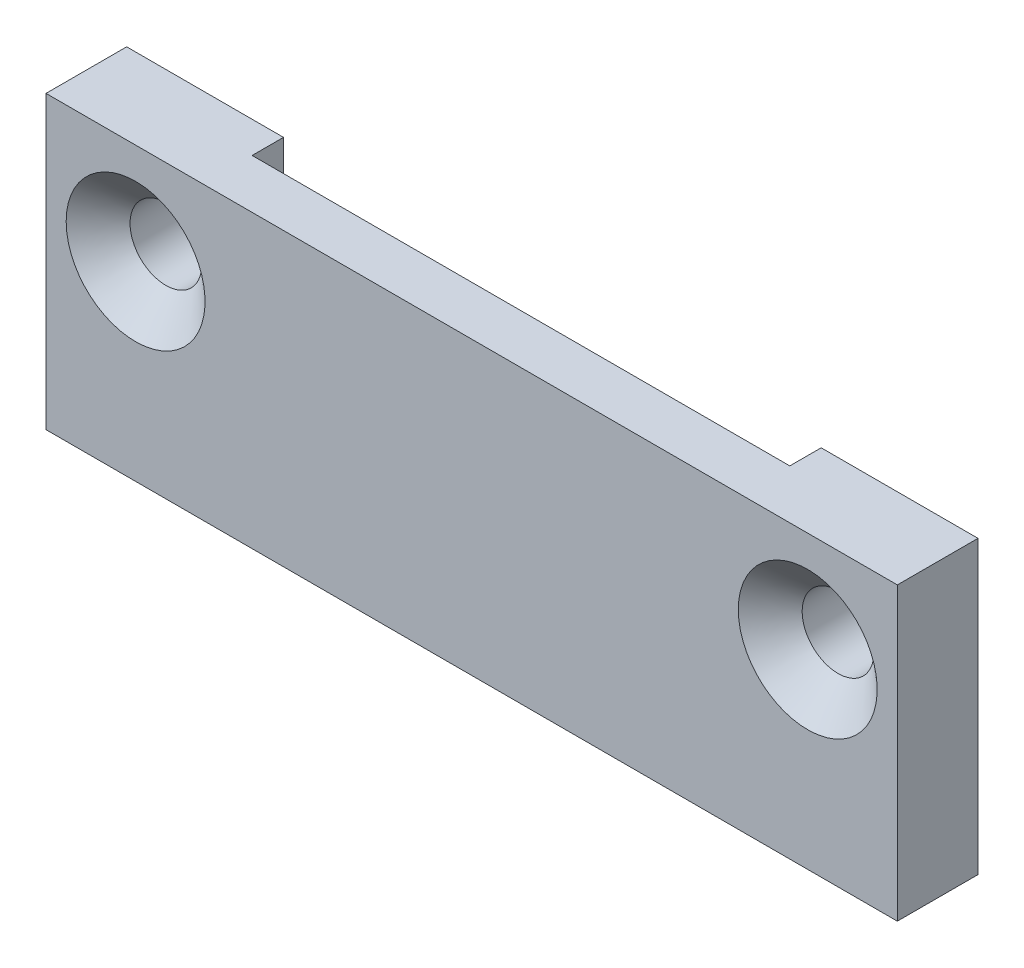
ISO-10303-21;
HEADER;
FILE_DESCRIPTION(('STEP AP214'),'2;1');
FILE_NAME('part.step','',(''),(''),'','','');
FILE_SCHEMA(('AUTOMOTIVE_DESIGN { 1 0 10303 214 1 1 1 1 }'));
ENDSEC;
DATA;
#1=APPLICATION_CONTEXT('core data for automotive mechanical design processes');
#2=APPLICATION_PROTOCOL_DEFINITION('international standard','automotive_design',2000,#1);
#3=PRODUCT_CONTEXT('',#1,'mechanical');
#4=PRODUCT('Part','Part','',(#3));
#5=PRODUCT_RELATED_PRODUCT_CATEGORY('part','',(#4));
#6=PRODUCT_DEFINITION_FORMATION('','',#4);
#7=PRODUCT_DEFINITION_CONTEXT('part definition',#1,'design');
#8=PRODUCT_DEFINITION('design','',#6,#7);
#9=PRODUCT_DEFINITION_SHAPE('','',#8);
#10=(LENGTH_UNIT() NAMED_UNIT(*) SI_UNIT(.MILLI.,.METRE.));
#11=(NAMED_UNIT(*) PLANE_ANGLE_UNIT() SI_UNIT($,.RADIAN.));
#12=(NAMED_UNIT(*) SI_UNIT($,.STERADIAN.) SOLID_ANGLE_UNIT());
#13=UNCERTAINTY_MEASURE_WITH_UNIT(LENGTH_MEASURE(1.E-05),#10,'distance_accuracy_value','');
#14=(GEOMETRIC_REPRESENTATION_CONTEXT(3) GLOBAL_UNCERTAINTY_ASSIGNED_CONTEXT((#13)) GLOBAL_UNIT_ASSIGNED_CONTEXT((#10,
#11,#12)) REPRESENTATION_CONTEXT('',''));
#15=CARTESIAN_POINT('',(0.,0.,0.));
#16=DIRECTION('',(0.,0.,1.));
#17=DIRECTION('',(1.,0.,0.));
#18=AXIS2_PLACEMENT_3D('',#15,#16,#17);
#19=CARTESIAN_POINT('',(0.,0.,0.));
#20=DIRECTION('',(0.,0.,-1.));
#21=DIRECTION('',(-1.,0.,0.));
#22=AXIS2_PLACEMENT_3D('',#19,#20,#21);
#23=PLANE('',#22);
#24=DIRECTION('',(0.,1.,0.));
#25=VECTOR('',#24,1.);
#26=CARTESIAN_POINT('',(12.,-6.5,0.));
#27=LINE('',#26,#25);
#28=CARTESIAN_POINT('',(12.,-6.5,0.));
#29=VERTEX_POINT('',#28);
#30=CARTESIAN_POINT('',(12.,6.5,0.));
#31=VERTEX_POINT('',#30);
#32=EDGE_CURVE('E179',#29,#31,#27,.T.);
#33=ORIENTED_EDGE('',*,*,#32,.T.);
#34=DIRECTION('',(-1.,0.,0.));
#35=VECTOR('',#34,1.);
#36=CARTESIAN_POINT('',(19.,6.50000000000001,0.));
#37=LINE('',#36,#35);
#38=CARTESIAN_POINT('',(19.,6.50000000000001,0.));
#39=VERTEX_POINT('',#38);
#40=EDGE_CURVE('E139',#39,#31,#37,.T.);
#41=ORIENTED_EDGE('',*,*,#40,.F.);
#42=DIRECTION('',(0.,1.,0.));
#43=VECTOR('',#42,1.);
#44=CARTESIAN_POINT('',(19.,6.50000000000001,0.));
#45=LINE('',#44,#43);
#46=CARTESIAN_POINT('',(19.,-6.49999999999999,0.));
#47=VERTEX_POINT('',#46);
#48=EDGE_CURVE('E131',#47,#39,#45,.T.);
#49=ORIENTED_EDGE('',*,*,#48,.F.);
#50=DIRECTION('',(1.,0.,0.));
#51=VECTOR('',#50,1.);
#52=CARTESIAN_POINT('',(19.,-6.49999999999999,0.));
#53=LINE('',#52,#51);
#54=EDGE_CURVE('E132',#29,#47,#53,.T.);
#55=ORIENTED_EDGE('',*,*,#54,.F.);
#56=EDGE_LOOP('',(#33,#41,#49,#55));
#57=FACE_BOUND('',#56,.T.);
#58=CARTESIAN_POINT('',(15.,1.99999999999999,0.));
#59=DIRECTION('',(0.,0.,1.));
#60=DIRECTION('',(-1.,0.,0.));
#61=AXIS2_PLACEMENT_3D('',#58,#59,#60);
#62=CIRCLE('',#61,1.6);
#63=CARTESIAN_POINT('',(13.4,1.99999999999999,0.));
#64=VERTEX_POINT('',#63);
#65=EDGE_CURVE('E176',#64,#64,#62,.T.);
#66=ORIENTED_EDGE('',*,*,#65,.T.);
#67=EDGE_LOOP('',(#66));
#68=FACE_BOUND('',#67,.T.);
#69=ADVANCED_FACE('F37',(#57,#68),#23,.T.);
#70=CARTESIAN_POINT('',(0.,0.,3.6));
#71=DIRECTION('',(0.,0.,-1.));
#72=DIRECTION('',(-1.,0.,0.));
#73=AXIS2_PLACEMENT_3D('',#70,#71,#72);
#74=PLANE('',#73);
#75=CARTESIAN_POINT('',(15.,1.99999999999999,3.6));
#76=DIRECTION('',(0.,0.,-1.));
#77=DIRECTION('',(-1.,0.,0.));
#78=AXIS2_PLACEMENT_3D('',#75,#76,#77);
#79=CIRCLE('',#78,3.10000000000002);
#80=CARTESIAN_POINT('',(11.9,1.99999999999999,3.6));
#81=VERTEX_POINT('',#80);
#82=EDGE_CURVE('E46',#81,#81,#79,.T.);
#83=ORIENTED_EDGE('',*,*,#82,.T.);
#84=EDGE_LOOP('',(#83));
#85=FACE_BOUND('',#84,.T.);
#86=CARTESIAN_POINT('',(-15.,1.99999999999999,3.6));
#87=DIRECTION('',(0.,0.,-1.));
#88=DIRECTION('',(-1.,0.,0.));
#89=AXIS2_PLACEMENT_3D('',#86,#87,#88);
#90=CIRCLE('',#89,3.10000000000002);
#91=CARTESIAN_POINT('',(-18.1,1.99999999999999,3.6));
#92=VERTEX_POINT('',#91);
#93=EDGE_CURVE('E155',#92,#92,#90,.T.);
#94=ORIENTED_EDGE('',*,*,#93,.T.);
#95=EDGE_LOOP('',(#94));
#96=FACE_BOUND('',#95,.T.);
#97=DIRECTION('',(0.,-1.,0.));
#98=VECTOR('',#97,1.);
#99=CARTESIAN_POINT('',(-19.,6.49999999999999,3.6));
#100=LINE('',#99,#98);
#101=CARTESIAN_POINT('',(-19.,6.49999999999999,3.6));
#102=VERTEX_POINT('',#101);
#103=CARTESIAN_POINT('',(-19.,-6.5,3.6));
#104=VERTEX_POINT('',#103);
#105=EDGE_CURVE('E142',#102,#104,#100,.T.);
#106=ORIENTED_EDGE('',*,*,#105,.T.);
#107=DIRECTION('',(1.,0.,0.));
#108=VECTOR('',#107,1.);
#109=CARTESIAN_POINT('',(19.,-6.49999999999999,3.6));
#110=LINE('',#109,#108);
#111=CARTESIAN_POINT('',(19.,-6.49999999999999,3.6));
#112=VERTEX_POINT('',#111);
#113=EDGE_CURVE('E90',#104,#112,#110,.T.);
#114=ORIENTED_EDGE('',*,*,#113,.T.);
#115=DIRECTION('',(0.,1.,0.));
#116=VECTOR('',#115,1.);
#117=CARTESIAN_POINT('',(19.,6.50000000000001,3.6));
#118=LINE('',#117,#116);
#119=CARTESIAN_POINT('',(19.,6.50000000000001,3.6));
#120=VERTEX_POINT('',#119);
#121=EDGE_CURVE('E190',#112,#120,#118,.T.);
#122=ORIENTED_EDGE('',*,*,#121,.T.);
#123=DIRECTION('',(-1.,0.,0.));
#124=VECTOR('',#123,1.);
#125=CARTESIAN_POINT('',(19.,6.50000000000001,3.6));
#126=LINE('',#125,#124);
#127=EDGE_CURVE('E62',#120,#102,#126,.T.);
#128=ORIENTED_EDGE('',*,*,#127,.T.);
#129=EDGE_LOOP('',(#106,#114,#122,#128));
#130=FACE_BOUND('',#129,.T.);
#131=ADVANCED_FACE('F160',(#85,#96,#130),#74,.F.);
#132=DIRECTION('',(0.,1.,0.));
#133=VECTOR('',#132,1.);
#134=CARTESIAN_POINT('',(-12.,-6.50000000000001,0.));
#135=LINE('',#134,#133);
#136=CARTESIAN_POINT('',(-12.,-6.50000000000001,0.));
#137=VERTEX_POINT('',#136);
#138=CARTESIAN_POINT('',(-12.,6.49999999999999,0.));
#139=VERTEX_POINT('',#138);
#140=EDGE_CURVE('E53',#137,#139,#135,.T.);
#141=ORIENTED_EDGE('',*,*,#140,.F.);
#142=CARTESIAN_POINT('',(-19.,-6.5,0.));
#143=VERTEX_POINT('',#142);
#144=EDGE_CURVE('E124',#143,#137,#53,.T.);
#145=ORIENTED_EDGE('',*,*,#144,.F.);
#146=DIRECTION('',(0.,-1.,0.));
#147=VECTOR('',#146,1.);
#148=CARTESIAN_POINT('',(-19.,6.49999999999999,0.));
#149=LINE('',#148,#147);
#150=CARTESIAN_POINT('',(-19.,6.49999999999999,0.));
#151=VERTEX_POINT('',#150);
#152=EDGE_CURVE('E135',#151,#143,#149,.T.);
#153=ORIENTED_EDGE('',*,*,#152,.F.);
#154=EDGE_CURVE('E82',#139,#151,#37,.T.);
#155=ORIENTED_EDGE('',*,*,#154,.F.);
#156=EDGE_LOOP('',(#141,#145,#153,#155));
#157=FACE_BOUND('',#156,.T.);
#158=CARTESIAN_POINT('',(-15.,1.99999999999999,0.));
#159=DIRECTION('',(0.,0.,1.));
#160=DIRECTION('',(1.,0.,0.));
#161=AXIS2_PLACEMENT_3D('',#158,#159,#160);
#162=CIRCLE('',#161,1.6);
#163=CARTESIAN_POINT('',(-13.4,1.99999999999999,0.));
#164=VERTEX_POINT('',#163);
#165=EDGE_CURVE('E178',#164,#164,#162,.T.);
#166=ORIENTED_EDGE('',*,*,#165,.T.);
#167=EDGE_LOOP('',(#166));
#168=FACE_BOUND('',#167,.T.);
#169=ADVANCED_FACE('F121',(#157,#168),#23,.T.);
#170=CARTESIAN_POINT('',(-19.,6.49999999999999,3.6));
#171=DIRECTION('',(1.,0.,0.));
#172=DIRECTION('',(0.,1.,0.));
#173=AXIS2_PLACEMENT_3D('',#170,#171,#172);
#174=PLANE('',#173);
#175=ORIENTED_EDGE('',*,*,#152,.T.);
#176=DIRECTION('',(0.,0.,-1.));
#177=VECTOR('',#176,1.);
#178=CARTESIAN_POINT('',(-19.,-6.5,3.6));
#179=LINE('',#178,#177);
#180=EDGE_CURVE('E129',#104,#143,#179,.T.);
#181=ORIENTED_EDGE('',*,*,#180,.F.);
#182=ORIENTED_EDGE('',*,*,#105,.F.);
#183=DIRECTION('',(0.,0.,-1.));
#184=VECTOR('',#183,1.);
#185=CARTESIAN_POINT('',(-19.,6.49999999999999,3.6));
#186=LINE('',#185,#184);
#187=EDGE_CURVE('E143',#102,#151,#186,.T.);
#188=ORIENTED_EDGE('',*,*,#187,.T.);
#189=EDGE_LOOP('',(#175,#181,#182,#188));
#190=FACE_BOUND('',#189,.T.);
#191=ADVANCED_FACE('F200',(#190),#174,.F.);
#192=CARTESIAN_POINT('',(19.,-6.49999999999999,3.6));
#193=DIRECTION('',(0.,1.,0.));
#194=DIRECTION('',(-1.,0.,0.));
#195=AXIS2_PLACEMENT_3D('',#192,#193,#194);
#196=PLANE('',#195);
#197=DIRECTION('',(1.,0.,0.));
#198=VECTOR('',#197,1.);
#199=CARTESIAN_POINT('',(-12.,-6.50000000000001,1.40000000000001));
#200=LINE('',#199,#198);
#201=CARTESIAN_POINT('',(-12.,-6.50000000000001,1.40000000000001));
#202=VERTEX_POINT('',#201);
#203=CARTESIAN_POINT('',(12.,-6.5,1.40000000000001));
#204=VERTEX_POINT('',#203);
#205=EDGE_CURVE('E117',#202,#204,#200,.T.);
#206=ORIENTED_EDGE('',*,*,#205,.T.);
#207=DIRECTION('',(0.,0.,-1.));
#208=VECTOR('',#207,1.);
#209=CARTESIAN_POINT('',(12.,-6.5,1.40000000000001));
#210=LINE('',#209,#208);
#211=EDGE_CURVE('E125',#204,#29,#210,.T.);
#212=ORIENTED_EDGE('',*,*,#211,.T.);
#213=ORIENTED_EDGE('',*,*,#54,.T.);
#214=DIRECTION('',(0.,0.,-1.));
#215=VECTOR('',#214,1.);
#216=CARTESIAN_POINT('',(19.,-6.49999999999999,3.6));
#217=LINE('',#216,#215);
#218=EDGE_CURVE('E148',#112,#47,#217,.T.);
#219=ORIENTED_EDGE('',*,*,#218,.F.);
#220=ORIENTED_EDGE('',*,*,#113,.F.);
#221=ORIENTED_EDGE('',*,*,#180,.T.);
#222=ORIENTED_EDGE('',*,*,#144,.T.);
#223=DIRECTION('',(0.,0.,1.));
#224=VECTOR('',#223,1.);
#225=CARTESIAN_POINT('',(-12.,-6.50000000000001,0.));
#226=LINE('',#225,#224);
#227=EDGE_CURVE('E111',#137,#202,#226,.T.);
#228=ORIENTED_EDGE('',*,*,#227,.T.);
#229=EDGE_LOOP('',(#206,#212,#213,#219,#220,#221,#222,#228));
#230=FACE_BOUND('',#229,.T.);
#231=ADVANCED_FACE('F127',(#230),#196,.F.);
#232=CARTESIAN_POINT('',(19.,6.50000000000001,3.6));
#233=DIRECTION('',(-1.,0.,0.));
#234=DIRECTION('',(0.,-1.,0.));
#235=AXIS2_PLACEMENT_3D('',#232,#233,#234);
#236=PLANE('',#235);
#237=ORIENTED_EDGE('',*,*,#48,.T.);
#238=DIRECTION('',(0.,0.,-1.));
#239=VECTOR('',#238,1.);
#240=CARTESIAN_POINT('',(19.,6.50000000000001,3.6));
#241=LINE('',#240,#239);
#242=EDGE_CURVE('E145',#120,#39,#241,.T.);
#243=ORIENTED_EDGE('',*,*,#242,.F.);
#244=ORIENTED_EDGE('',*,*,#121,.F.);
#245=ORIENTED_EDGE('',*,*,#218,.T.);
#246=EDGE_LOOP('',(#237,#243,#244,#245));
#247=FACE_BOUND('',#246,.T.);
#248=ADVANCED_FACE('F194',(#247),#236,.F.);
#249=CARTESIAN_POINT('',(19.,6.50000000000001,3.6));
#250=DIRECTION('',(0.,-1.,0.));
#251=DIRECTION('',(1.,0.,0.));
#252=AXIS2_PLACEMENT_3D('',#249,#250,#251);
#253=PLANE('',#252);
#254=ORIENTED_EDGE('',*,*,#40,.T.);
#255=DIRECTION('',(0.,0.,-1.));
#256=VECTOR('',#255,1.);
#257=CARTESIAN_POINT('',(12.,6.5,1.40000000000001));
#258=LINE('',#257,#256);
#259=CARTESIAN_POINT('',(12.,6.5,1.40000000000001));
#260=VERTEX_POINT('',#259);
#261=EDGE_CURVE('E118',#260,#31,#258,.T.);
#262=ORIENTED_EDGE('',*,*,#261,.F.);
#263=DIRECTION('',(1.,0.,0.));
#264=VECTOR('',#263,1.);
#265=CARTESIAN_POINT('',(-12.,6.49999999999999,1.40000000000001));
#266=LINE('',#265,#264);
#267=CARTESIAN_POINT('',(-12.,6.49999999999999,1.40000000000001));
#268=VERTEX_POINT('',#267);
#269=EDGE_CURVE('E320',#268,#260,#266,.T.);
#270=ORIENTED_EDGE('',*,*,#269,.F.);
#271=DIRECTION('',(0.,0.,1.));
#272=VECTOR('',#271,1.);
#273=CARTESIAN_POINT('',(-12.,6.49999999999999,0.));
#274=LINE('',#273,#272);
#275=EDGE_CURVE('E323',#139,#268,#274,.T.);
#276=ORIENTED_EDGE('',*,*,#275,.F.);
#277=ORIENTED_EDGE('',*,*,#154,.T.);
#278=ORIENTED_EDGE('',*,*,#187,.F.);
#279=ORIENTED_EDGE('',*,*,#127,.F.);
#280=ORIENTED_EDGE('',*,*,#242,.T.);
#281=EDGE_LOOP('',(#254,#262,#270,#276,#277,#278,#279,#280));
#282=FACE_BOUND('',#281,.T.);
#283=ADVANCED_FACE('F197',(#282),#253,.F.);
#284=CARTESIAN_POINT('',(-15.,1.99999999999999,3.6));
#285=DIRECTION('',(0.,0.,-1.));
#286=DIRECTION('',(-1.,0.,0.));
#287=AXIS2_PLACEMENT_3D('',#284,#285,#286);
#288=CYLINDRICAL_SURFACE('',#287,1.6);
#289=CARTESIAN_POINT('',(-15.,1.99999999999999,2.24939393355324));
#290=DIRECTION('',(0.,0.,-1.));
#291=DIRECTION('',(-1.,0.,0.));
#292=AXIS2_PLACEMENT_3D('',#289,#290,#291);
#293=CIRCLE('',#292,1.6);
#294=CARTESIAN_POINT('',(-16.6,1.99999999999999,2.24939393355324));
#295=VERTEX_POINT('',#294);
#296=EDGE_CURVE('E11',#295,#295,#293,.F.);
#297=ORIENTED_EDGE('',*,*,#296,.T.);
#298=EDGE_LOOP('',(#297));
#299=FACE_BOUND('',#298,.T.);
#300=ORIENTED_EDGE('',*,*,#165,.F.);
#301=EDGE_LOOP('',(#300));
#302=FACE_BOUND('',#301,.T.);
#303=ADVANCED_FACE('F172',(#299,#302),#288,.F.);
#304=CARTESIAN_POINT('',(15.,1.99999999999999,3.6));
#305=DIRECTION('',(0.,0.,-1.));
#306=DIRECTION('',(-1.,0.,0.));
#307=AXIS2_PLACEMENT_3D('',#304,#305,#306);
#308=CYLINDRICAL_SURFACE('',#307,1.6);
#309=CARTESIAN_POINT('',(15.,1.99999999999999,2.24939393355324));
#310=DIRECTION('',(0.,0.,-1.));
#311=DIRECTION('',(-1.,0.,0.));
#312=AXIS2_PLACEMENT_3D('',#309,#310,#311);
#313=CIRCLE('',#312,1.6);
#314=CARTESIAN_POINT('',(13.4,1.99999999999999,2.24939393355324));
#315=VERTEX_POINT('',#314);
#316=EDGE_CURVE('E152',#315,#315,#313,.F.);
#317=ORIENTED_EDGE('',*,*,#316,.T.);
#318=EDGE_LOOP('',(#317));
#319=FACE_BOUND('',#318,.T.);
#320=ORIENTED_EDGE('',*,*,#65,.F.);
#321=EDGE_LOOP('',(#320));
#322=FACE_BOUND('',#321,.T.);
#323=ADVANCED_FACE('F168',(#319,#322),#308,.F.);
#324=CARTESIAN_POINT('',(12.,-6.5,1.40000000000001));
#325=DIRECTION('',(1.,0.,0.));
#326=DIRECTION('',(0.,1.,0.));
#327=AXIS2_PLACEMENT_3D('',#324,#325,#326);
#328=PLANE('',#327);
#329=ORIENTED_EDGE('',*,*,#261,.T.);
#330=ORIENTED_EDGE('',*,*,#32,.F.);
#331=ORIENTED_EDGE('',*,*,#211,.F.);
#332=DIRECTION('',(0.,1.,0.));
#333=VECTOR('',#332,1.);
#334=CARTESIAN_POINT('',(12.,-6.5,1.40000000000001));
#335=LINE('',#334,#333);
#336=EDGE_CURVE('E184',#204,#260,#335,.T.);
#337=ORIENTED_EDGE('',*,*,#336,.T.);
#338=EDGE_LOOP('',(#329,#330,#331,#337));
#339=FACE_BOUND('',#338,.T.);
#340=ADVANCED_FACE('F171',(#339),#328,.F.);
#341=CARTESIAN_POINT('',(-12.,-6.50000000000001,1.40000000000001));
#342=DIRECTION('',(0.,0.,1.));
#343=DIRECTION('',(1.,0.,0.));
#344=AXIS2_PLACEMENT_3D('',#341,#342,#343);
#345=PLANE('',#344);
#346=ORIENTED_EDGE('',*,*,#269,.T.);
#347=ORIENTED_EDGE('',*,*,#336,.F.);
#348=ORIENTED_EDGE('',*,*,#205,.F.);
#349=DIRECTION('',(0.,1.,0.));
#350=VECTOR('',#349,1.);
#351=CARTESIAN_POINT('',(-12.,-6.50000000000001,1.40000000000001));
#352=LINE('',#351,#350);
#353=EDGE_CURVE('E113',#202,#268,#352,.T.);
#354=ORIENTED_EDGE('',*,*,#353,.T.);
#355=EDGE_LOOP('',(#346,#347,#348,#354));
#356=FACE_BOUND('',#355,.T.);
#357=ADVANCED_FACE('F246',(#356),#345,.F.);
#358=CARTESIAN_POINT('',(-12.,-6.50000000000001,0.));
#359=DIRECTION('',(-1.,0.,0.));
#360=DIRECTION('',(0.,-1.,0.));
#361=AXIS2_PLACEMENT_3D('',#358,#359,#360);
#362=PLANE('',#361);
#363=ORIENTED_EDGE('',*,*,#275,.T.);
#364=ORIENTED_EDGE('',*,*,#353,.F.);
#365=ORIENTED_EDGE('',*,*,#227,.F.);
#366=ORIENTED_EDGE('',*,*,#140,.T.);
#367=EDGE_LOOP('',(#363,#364,#365,#366));
#368=FACE_BOUND('',#367,.T.);
#369=ADVANCED_FACE('F112',(#368),#362,.F.);
#370=CARTESIAN_POINT('',(15.,1.99999999999999,2.24939393355324));
#371=DIRECTION('',(0.,0.,1.));
#372=DIRECTION('',(1.,0.,0.));
#373=AXIS2_PLACEMENT_3D('',#370,#371,#372);
#374=CONICAL_SURFACE('',#373,1.6,0.837758040957281);
#375=ORIENTED_EDGE('',*,*,#82,.F.);
#376=EDGE_LOOP('',(#375));
#377=FACE_BOUND('',#376,.T.);
#378=ORIENTED_EDGE('',*,*,#316,.F.);
#379=EDGE_LOOP('',(#378));
#380=FACE_BOUND('',#379,.T.);
#381=ADVANCED_FACE('F163',(#377,#380),#374,.F.);
#382=CARTESIAN_POINT('',(-15.,1.99999999999999,2.24939393355324));
#383=DIRECTION('',(0.,0.,1.));
#384=DIRECTION('',(1.,0.,0.));
#385=AXIS2_PLACEMENT_3D('',#382,#383,#384);
#386=CONICAL_SURFACE('',#385,1.6,0.837758040957281);
#387=ORIENTED_EDGE('',*,*,#93,.F.);
#388=EDGE_LOOP('',(#387));
#389=FACE_BOUND('',#388,.T.);
#390=ORIENTED_EDGE('',*,*,#296,.F.);
#391=EDGE_LOOP('',(#390));
#392=FACE_BOUND('',#391,.T.);
#393=ADVANCED_FACE('F40',(#389,#392),#386,.F.);
#394=CLOSED_SHELL('',(#69,#131,#169,#191,#231,#248,#283,#303,#323,#340,#357,#369,#381,#393));
#395=MANIFOLD_SOLID_BREP('B2',#394);
#396=ADVANCED_BREP_SHAPE_REPRESENTATION('',(#18,#395),#14);
#397=SHAPE_DEFINITION_REPRESENTATION(#9,#396);
ENDSEC;
END-ISO-10303-21;
